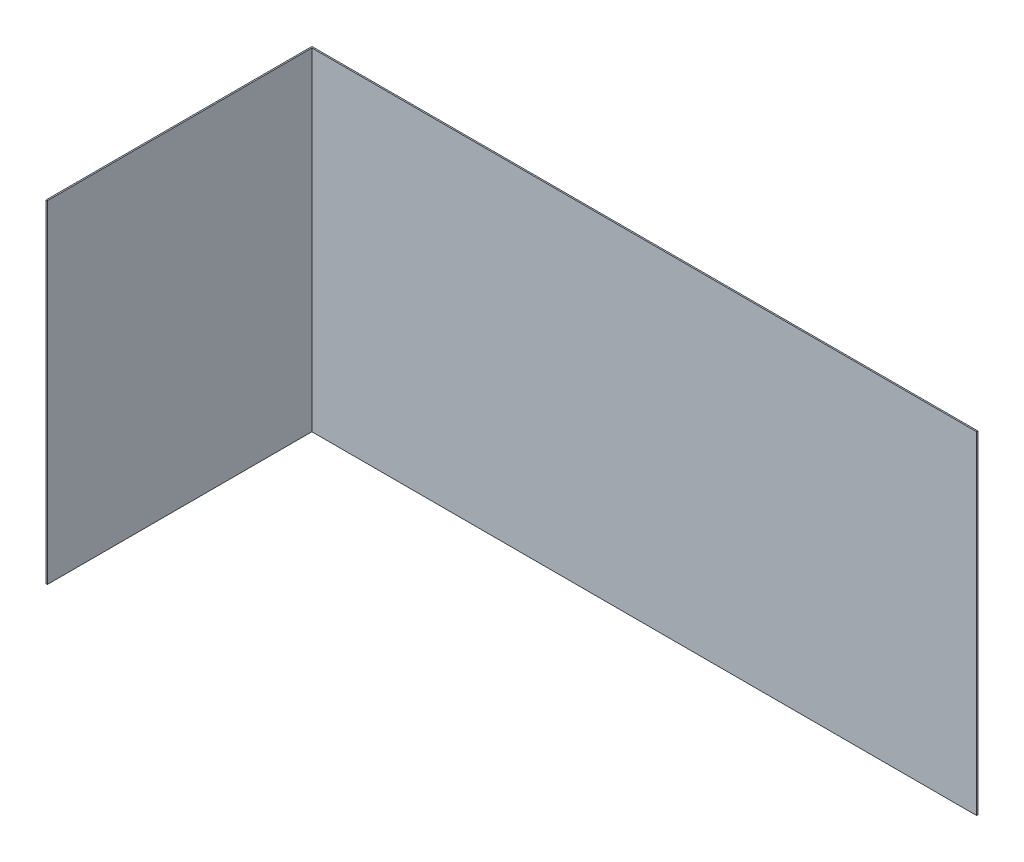
ISO-10303-21;
HEADER;
FILE_DESCRIPTION(('STEP AP214'),'2;1');
FILE_NAME('part.step','',(''),(''),'','','');
FILE_SCHEMA(('AUTOMOTIVE_DESIGN { 1 0 10303 214 1 1 1 1 }'));
ENDSEC;
DATA;
#1=APPLICATION_CONTEXT('core data for automotive mechanical design processes');
#2=APPLICATION_PROTOCOL_DEFINITION('international standard','automotive_design',2000,#1);
#3=PRODUCT_CONTEXT('',#1,'mechanical');
#4=PRODUCT('Part','Part','',(#3));
#5=PRODUCT_RELATED_PRODUCT_CATEGORY('part','',(#4));
#6=PRODUCT_DEFINITION_FORMATION('','',#4);
#7=PRODUCT_DEFINITION_CONTEXT('part definition',#1,'design');
#8=PRODUCT_DEFINITION('design','',#6,#7);
#9=PRODUCT_DEFINITION_SHAPE('','',#8);
#10=(LENGTH_UNIT() NAMED_UNIT(*) SI_UNIT(.MILLI.,.METRE.));
#11=(NAMED_UNIT(*) PLANE_ANGLE_UNIT() SI_UNIT($,.RADIAN.));
#12=(NAMED_UNIT(*) SI_UNIT($,.STERADIAN.) SOLID_ANGLE_UNIT());
#13=UNCERTAINTY_MEASURE_WITH_UNIT(LENGTH_MEASURE(1.E-05),#10,'distance_accuracy_value','');
#14=(GEOMETRIC_REPRESENTATION_CONTEXT(3) GLOBAL_UNCERTAINTY_ASSIGNED_CONTEXT((#13)) GLOBAL_UNIT_ASSIGNED_CONTEXT((#10,
#11,#12)) REPRESENTATION_CONTEXT('',''));
#15=CARTESIAN_POINT('',(0.,0.,0.));
#16=DIRECTION('',(0.,0.,1.));
#17=DIRECTION('',(1.,0.,0.));
#18=AXIS2_PLACEMENT_3D('',#15,#16,#17);
#19=CARTESIAN_POINT('',(0.,0.,0.2));
#20=DIRECTION('',(0.,0.,-1.));
#21=DIRECTION('',(-1.,0.,0.));
#22=AXIS2_PLACEMENT_3D('',#19,#20,#21);
#23=PLANE('',#22);
#24=DIRECTION('',(-1.,0.,0.));
#25=VECTOR('',#24,1.);
#26=CARTESIAN_POINT('',(0.,0.25,0.2));
#27=LINE('',#26,#25);
#28=CARTESIAN_POINT('',(0.,0.25,0.2));
#29=VERTEX_POINT('',#28);
#30=CARTESIAN_POINT('',(-0.00100000000000002,0.25,0.2));
#31=VERTEX_POINT('',#30);
#32=EDGE_CURVE('E87',#29,#31,#27,.T.);
#33=ORIENTED_EDGE('',*,*,#32,.T.);
#34=DIRECTION('',(0.,1.,0.));
#35=VECTOR('',#34,1.);
#36=CARTESIAN_POINT('',(-0.00100000000000004,0.,0.2));
#37=LINE('',#36,#35);
#38=CARTESIAN_POINT('',(-0.00100000000000004,0.,0.2));
#39=VERTEX_POINT('',#38);
#40=EDGE_CURVE('E71',#31,#39,#37,.F.);
#41=ORIENTED_EDGE('',*,*,#40,.T.);
#42=DIRECTION('',(-1.,0.,0.));
#43=VECTOR('',#42,1.);
#44=CARTESIAN_POINT('',(0.,0.,0.2));
#45=LINE('',#44,#43);
#46=CARTESIAN_POINT('',(0.,0.,0.2));
#47=VERTEX_POINT('',#46);
#48=EDGE_CURVE('E19',#39,#47,#45,.F.);
#49=ORIENTED_EDGE('',*,*,#48,.T.);
#50=DIRECTION('',(0.,1.,0.));
#51=VECTOR('',#50,1.);
#52=CARTESIAN_POINT('',(0.,0.,0.2));
#53=LINE('',#52,#51);
#54=EDGE_CURVE('E76',#29,#47,#53,.F.);
#55=ORIENTED_EDGE('',*,*,#54,.F.);
#56=EDGE_LOOP('',(#33,#41,#49,#55));
#57=FACE_BOUND('',#56,.T.);
#58=ADVANCED_FACE('F16',(#57),#23,.F.);
#59=CARTESIAN_POINT('',(0.,0.,0.));
#60=DIRECTION('',(1.,0.,0.));
#61=DIRECTION('',(0.,0.,-1.));
#62=AXIS2_PLACEMENT_3D('',#59,#60,#61);
#63=PLANE('',#62);
#64=DIRECTION('',(0.,0.,-1.));
#65=VECTOR('',#64,1.);
#66=CARTESIAN_POINT('',(0.,0.25,0.));
#67=LINE('',#66,#65);
#68=CARTESIAN_POINT('',(0.,0.25,0.000999999999999999));
#69=VERTEX_POINT('',#68);
#70=EDGE_CURVE('E110',#69,#29,#67,.F.);
#71=ORIENTED_EDGE('',*,*,#70,.T.);
#72=ORIENTED_EDGE('',*,*,#54,.T.);
#73=DIRECTION('',(0.,0.,-1.));
#74=VECTOR('',#73,1.);
#75=CARTESIAN_POINT('',(0.,0.,0.));
#76=LINE('',#75,#74);
#77=CARTESIAN_POINT('',(0.,0.,0.001));
#78=VERTEX_POINT('',#77);
#79=EDGE_CURVE('E82',#47,#78,#76,.T.);
#80=ORIENTED_EDGE('',*,*,#79,.T.);
#81=DIRECTION('',(0.,1.,0.));
#82=VECTOR('',#81,1.);
#83=CARTESIAN_POINT('',(0.,0.,0.001));
#84=LINE('',#83,#82);
#85=EDGE_CURVE('E99',#78,#69,#84,.T.);
#86=ORIENTED_EDGE('',*,*,#85,.T.);
#87=EDGE_LOOP('',(#71,#72,#80,#86));
#88=FACE_BOUND('',#87,.T.);
#89=ADVANCED_FACE('F111',(#88),#63,.T.);
#90=CARTESIAN_POINT('',(-0.001,0.25,0.));
#91=DIRECTION('',(1.,0.,0.));
#92=DIRECTION('',(0.,0.,-1.));
#93=AXIS2_PLACEMENT_3D('',#90,#91,#92);
#94=PLANE('',#93);
#95=DIRECTION('',(0.,0.,1.));
#96=VECTOR('',#95,1.);
#97=CARTESIAN_POINT('',(-0.001,0.,0.));
#98=LINE('',#97,#96);
#99=CARTESIAN_POINT('',(-0.001,0.,0.));
#100=VERTEX_POINT('',#99);
#101=EDGE_CURVE('E66',#39,#100,#98,.F.);
#102=ORIENTED_EDGE('',*,*,#101,.F.);
#103=ORIENTED_EDGE('',*,*,#40,.F.);
#104=DIRECTION('',(0.,0.,-1.));
#105=VECTOR('',#104,1.);
#106=CARTESIAN_POINT('',(-0.001,0.25,0.));
#107=LINE('',#106,#105);
#108=CARTESIAN_POINT('',(-0.001,0.25,0.));
#109=VERTEX_POINT('',#108);
#110=EDGE_CURVE('E75',#31,#109,#107,.T.);
#111=ORIENTED_EDGE('',*,*,#110,.T.);
#112=DIRECTION('',(0.,1.,0.));
#113=VECTOR('',#112,1.);
#114=CARTESIAN_POINT('',(-0.001,0.,0.));
#115=LINE('',#114,#113);
#116=EDGE_CURVE('E73',#100,#109,#115,.T.);
#117=ORIENTED_EDGE('',*,*,#116,.F.);
#118=EDGE_LOOP('',(#102,#103,#111,#117));
#119=FACE_BOUND('',#118,.T.);
#120=ADVANCED_FACE('F68',(#119),#94,.F.);
#121=CARTESIAN_POINT('',(-0.001,0.,0.001));
#122=DIRECTION('',(0.,0.,-1.));
#123=DIRECTION('',(-1.,0.,0.));
#124=AXIS2_PLACEMENT_3D('',#121,#122,#123);
#125=PLANE('',#124);
#126=DIRECTION('',(1.,0.,0.));
#127=VECTOR('',#126,1.);
#128=CARTESIAN_POINT('',(0.5,0.25,0.001));
#129=LINE('',#128,#127);
#130=CARTESIAN_POINT('',(0.5,0.25,0.001));
#131=VERTEX_POINT('',#130);
#132=EDGE_CURVE('E98',#131,#69,#129,.F.);
#133=ORIENTED_EDGE('',*,*,#132,.T.);
#134=ORIENTED_EDGE('',*,*,#85,.F.);
#135=DIRECTION('',(1.,0.,0.));
#136=VECTOR('',#135,1.);
#137=CARTESIAN_POINT('',(-0.001,0.,0.001));
#138=LINE('',#137,#136);
#139=CARTESIAN_POINT('',(0.5,0.,0.001));
#140=VERTEX_POINT('',#139);
#141=EDGE_CURVE('E101',#78,#140,#138,.T.);
#142=ORIENTED_EDGE('',*,*,#141,.T.);
#143=DIRECTION('',(0.,1.,0.));
#144=VECTOR('',#143,1.);
#145=CARTESIAN_POINT('',(0.5,0.,0.001));
#146=LINE('',#145,#144);
#147=EDGE_CURVE('E94',#140,#131,#146,.T.);
#148=ORIENTED_EDGE('',*,*,#147,.T.);
#149=EDGE_LOOP('',(#133,#134,#142,#148));
#150=FACE_BOUND('',#149,.T.);
#151=ADVANCED_FACE('F113',(#150),#125,.F.);
#152=CARTESIAN_POINT('',(-0.001,0.,0.));
#153=DIRECTION('',(0.,1.,0.));
#154=DIRECTION('',(0.,0.,1.));
#155=AXIS2_PLACEMENT_3D('',#152,#153,#154);
#156=PLANE('',#155);
#157=ORIENTED_EDGE('',*,*,#141,.F.);
#158=ORIENTED_EDGE('',*,*,#79,.F.);
#159=ORIENTED_EDGE('',*,*,#48,.F.);
#160=ORIENTED_EDGE('',*,*,#101,.T.);
#161=DIRECTION('',(-1.,0.,0.));
#162=VECTOR('',#161,1.);
#163=CARTESIAN_POINT('',(-0.001,0.,0.));
#164=LINE('',#163,#162);
#165=CARTESIAN_POINT('',(0.5,0.,0.));
#166=VERTEX_POINT('',#165);
#167=EDGE_CURVE('E93',#166,#100,#164,.T.);
#168=ORIENTED_EDGE('',*,*,#167,.F.);
#169=DIRECTION('',(0.,0.,1.));
#170=VECTOR('',#169,1.);
#171=CARTESIAN_POINT('',(0.5,0.,0.));
#172=LINE('',#171,#170);
#173=EDGE_CURVE('E95',#166,#140,#172,.T.);
#174=ORIENTED_EDGE('',*,*,#173,.T.);
#175=EDGE_LOOP('',(#157,#158,#159,#160,#168,#174));
#176=FACE_BOUND('',#175,.T.);
#177=ADVANCED_FACE('F81',(#176),#156,.F.);
#178=CARTESIAN_POINT('',(0.5,0.25,0.));
#179=DIRECTION('',(0.,-1.,0.));
#180=DIRECTION('',(0.,0.,-1.));
#181=AXIS2_PLACEMENT_3D('',#178,#179,#180);
#182=PLANE('',#181);
#183=ORIENTED_EDGE('',*,*,#132,.F.);
#184=DIRECTION('',(0.,0.,-1.));
#185=VECTOR('',#184,1.);
#186=CARTESIAN_POINT('',(0.5,0.25,0.));
#187=LINE('',#186,#185);
#188=CARTESIAN_POINT('',(0.5,0.25,0.));
#189=VERTEX_POINT('',#188);
#190=EDGE_CURVE('E34',#131,#189,#187,.T.);
#191=ORIENTED_EDGE('',*,*,#190,.T.);
#192=DIRECTION('',(-1.,0.,0.));
#193=VECTOR('',#192,1.);
#194=CARTESIAN_POINT('',(-0.001,0.25,0.));
#195=LINE('',#194,#193);
#196=EDGE_CURVE('E25',#109,#189,#195,.F.);
#197=ORIENTED_EDGE('',*,*,#196,.F.);
#198=ORIENTED_EDGE('',*,*,#110,.F.);
#199=ORIENTED_EDGE('',*,*,#32,.F.);
#200=ORIENTED_EDGE('',*,*,#70,.F.);
#201=EDGE_LOOP('',(#183,#191,#197,#198,#199,#200));
#202=FACE_BOUND('',#201,.T.);
#203=ADVANCED_FACE('F126',(#202),#182,.F.);
#204=CARTESIAN_POINT('',(0.5,0.,0.));
#205=DIRECTION('',(-1.,0.,0.));
#206=DIRECTION('',(0.,0.,1.));
#207=AXIS2_PLACEMENT_3D('',#204,#205,#206);
#208=PLANE('',#207);
#209=ORIENTED_EDGE('',*,*,#190,.F.);
#210=ORIENTED_EDGE('',*,*,#147,.F.);
#211=ORIENTED_EDGE('',*,*,#173,.F.);
#212=DIRECTION('',(0.,1.,0.));
#213=VECTOR('',#212,1.);
#214=CARTESIAN_POINT('',(0.5,0.,0.));
#215=LINE('',#214,#213);
#216=EDGE_CURVE('E11',#189,#166,#215,.F.);
#217=ORIENTED_EDGE('',*,*,#216,.F.);
#218=EDGE_LOOP('',(#209,#210,#211,#217));
#219=FACE_BOUND('',#218,.T.);
#220=ADVANCED_FACE('F118',(#219),#208,.F.);
#221=CARTESIAN_POINT('',(-0.001,0.,0.));
#222=DIRECTION('',(0.,0.,-1.));
#223=DIRECTION('',(-1.,0.,0.));
#224=AXIS2_PLACEMENT_3D('',#221,#222,#223);
#225=PLANE('',#224);
#226=ORIENTED_EDGE('',*,*,#196,.T.);
#227=ORIENTED_EDGE('',*,*,#216,.T.);
#228=ORIENTED_EDGE('',*,*,#167,.T.);
#229=ORIENTED_EDGE('',*,*,#116,.T.);
#230=EDGE_LOOP('',(#226,#227,#228,#229));
#231=FACE_BOUND('',#230,.T.);
#232=ADVANCED_FACE('F125',(#231),#225,.T.);
#233=CLOSED_SHELL('',(#58,#89,#120,#151,#177,#203,#220,#232));
#234=MANIFOLD_SOLID_BREP('B1',#233);
#235=ADVANCED_BREP_SHAPE_REPRESENTATION('',(#18,#234),#14);
#236=SHAPE_DEFINITION_REPRESENTATION(#9,#235);
ENDSEC;
END-ISO-10303-21;
